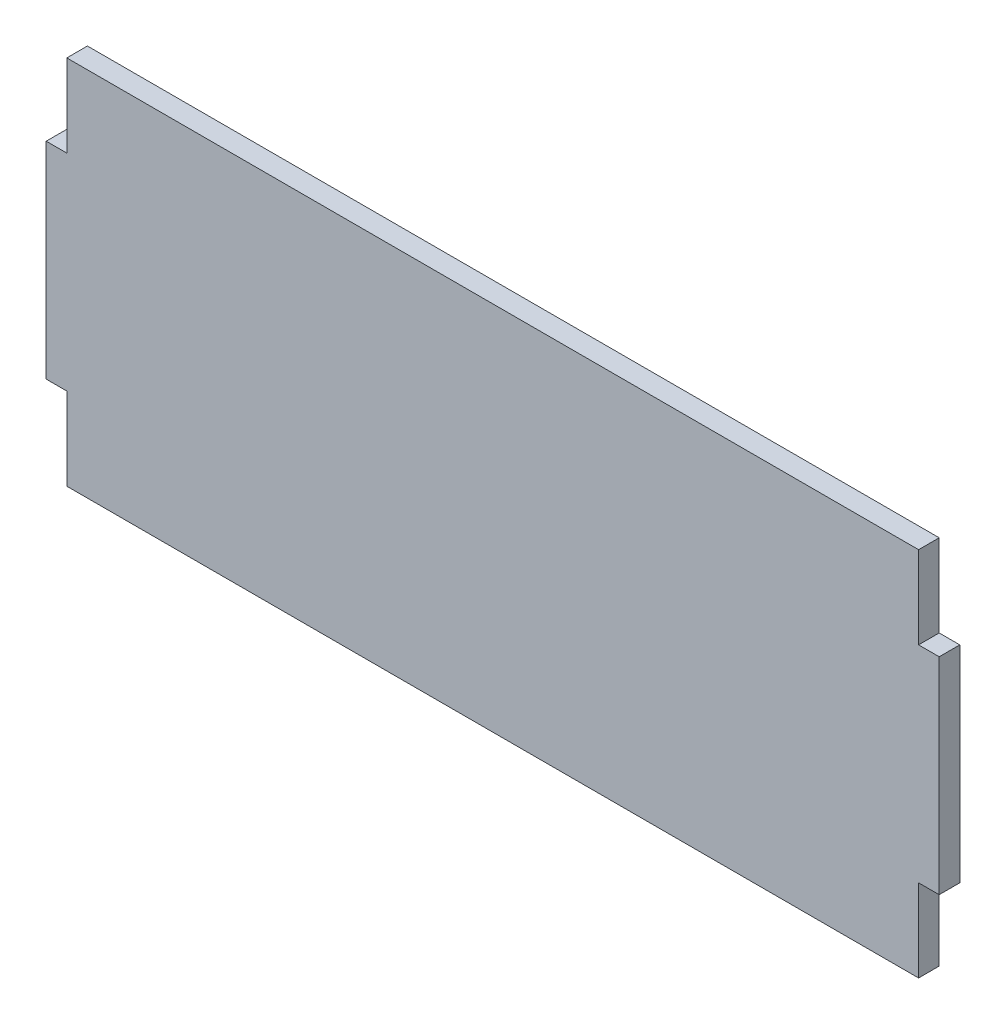
ISO-10303-21;
HEADER;
FILE_DESCRIPTION(('STEP AP214'),'2;1');
FILE_NAME('part.step','',(''),(''),'','','');
FILE_SCHEMA(('AUTOMOTIVE_DESIGN { 1 0 10303 214 1 1 1 1 }'));
ENDSEC;
DATA;
#1=APPLICATION_CONTEXT('core data for automotive mechanical design processes');
#2=APPLICATION_PROTOCOL_DEFINITION('international standard','automotive_design',2000,#1);
#3=PRODUCT_CONTEXT('',#1,'mechanical');
#4=PRODUCT('Part','Part','',(#3));
#5=PRODUCT_RELATED_PRODUCT_CATEGORY('part','',(#4));
#6=PRODUCT_DEFINITION_FORMATION('','',#4);
#7=PRODUCT_DEFINITION_CONTEXT('part definition',#1,'design');
#8=PRODUCT_DEFINITION('design','',#6,#7);
#9=PRODUCT_DEFINITION_SHAPE('','',#8);
#10=(LENGTH_UNIT() NAMED_UNIT(*) SI_UNIT(.MILLI.,.METRE.));
#11=(NAMED_UNIT(*) PLANE_ANGLE_UNIT() SI_UNIT($,.RADIAN.));
#12=(NAMED_UNIT(*) SI_UNIT($,.STERADIAN.) SOLID_ANGLE_UNIT());
#13=UNCERTAINTY_MEASURE_WITH_UNIT(LENGTH_MEASURE(1.E-05),#10,'distance_accuracy_value','');
#14=(GEOMETRIC_REPRESENTATION_CONTEXT(3) GLOBAL_UNCERTAINTY_ASSIGNED_CONTEXT((#13)) GLOBAL_UNIT_ASSIGNED_CONTEXT((#10,
#11,#12)) REPRESENTATION_CONTEXT('',''));
#15=CARTESIAN_POINT('',(0.,0.,0.));
#16=DIRECTION('',(0.,0.,1.));
#17=DIRECTION('',(1.,0.,0.));
#18=AXIS2_PLACEMENT_3D('',#15,#16,#17);
#19=CARTESIAN_POINT('',(124.,0.,3.));
#20=DIRECTION('',(0.,1.,0.));
#21=DIRECTION('',(0.,0.,1.));
#22=AXIS2_PLACEMENT_3D('',#19,#20,#21);
#23=PLANE('',#22);
#24=DIRECTION('',(1.,0.,0.));
#25=VECTOR('',#24,1.);
#26=CARTESIAN_POINT('',(124.,0.,0.));
#27=LINE('',#26,#25);
#28=CARTESIAN_POINT('',(0.,0.,0.));
#29=VERTEX_POINT('',#28);
#30=CARTESIAN_POINT('',(124.,0.,0.));
#31=VERTEX_POINT('',#30);
#32=EDGE_CURVE('E153',#29,#31,#27,.T.);
#33=ORIENTED_EDGE('',*,*,#32,.T.);
#34=DIRECTION('',(0.,0.,-1.));
#35=VECTOR('',#34,1.);
#36=CARTESIAN_POINT('',(124.,0.,3.));
#37=LINE('',#36,#35);
#38=CARTESIAN_POINT('',(124.,0.,3.));
#39=VERTEX_POINT('',#38);
#40=EDGE_CURVE('E11',#39,#31,#37,.T.);
#41=ORIENTED_EDGE('',*,*,#40,.F.);
#42=DIRECTION('',(1.,0.,0.));
#43=VECTOR('',#42,1.);
#44=CARTESIAN_POINT('',(124.,0.,3.));
#45=LINE('',#44,#43);
#46=CARTESIAN_POINT('',(0.,0.,3.));
#47=VERTEX_POINT('',#46);
#48=EDGE_CURVE('E175',#47,#39,#45,.T.);
#49=ORIENTED_EDGE('',*,*,#48,.F.);
#50=DIRECTION('',(0.,0.,-1.));
#51=VECTOR('',#50,1.);
#52=CARTESIAN_POINT('',(0.,0.,3.));
#53=LINE('',#52,#51);
#54=EDGE_CURVE('E149',#47,#29,#53,.T.);
#55=ORIENTED_EDGE('',*,*,#54,.T.);
#56=EDGE_LOOP('',(#33,#41,#49,#55));
#57=FACE_BOUND('',#56,.T.);
#58=ADVANCED_FACE('F33',(#57),#23,.F.);
#59=CARTESIAN_POINT('',(124.,12.,3.));
#60=DIRECTION('',(-1.,0.,0.));
#61=DIRECTION('',(0.,0.,1.));
#62=AXIS2_PLACEMENT_3D('',#59,#60,#61);
#63=PLANE('',#62);
#64=DIRECTION('',(0.,1.,0.));
#65=VECTOR('',#64,1.);
#66=CARTESIAN_POINT('',(124.,12.,0.));
#67=LINE('',#66,#65);
#68=CARTESIAN_POINT('',(124.,12.,0.));
#69=VERTEX_POINT('',#68);
#70=EDGE_CURVE('E156',#31,#69,#67,.T.);
#71=ORIENTED_EDGE('',*,*,#70,.T.);
#72=DIRECTION('',(0.,0.,-1.));
#73=VECTOR('',#72,1.);
#74=CARTESIAN_POINT('',(124.,12.,3.));
#75=LINE('',#74,#73);
#76=CARTESIAN_POINT('',(124.,12.,3.));
#77=VERTEX_POINT('',#76);
#78=EDGE_CURVE('E41',#77,#69,#75,.T.);
#79=ORIENTED_EDGE('',*,*,#78,.F.);
#80=DIRECTION('',(0.,1.,0.));
#81=VECTOR('',#80,1.);
#82=CARTESIAN_POINT('',(124.,12.,3.));
#83=LINE('',#82,#81);
#84=EDGE_CURVE('E104',#39,#77,#83,.T.);
#85=ORIENTED_EDGE('',*,*,#84,.F.);
#86=ORIENTED_EDGE('',*,*,#40,.T.);
#87=EDGE_LOOP('',(#71,#79,#85,#86));
#88=FACE_BOUND('',#87,.T.);
#89=ADVANCED_FACE('F253',(#88),#63,.F.);
#90=CARTESIAN_POINT('',(127.,12.,3.));
#91=DIRECTION('',(0.,1.,0.));
#92=DIRECTION('',(-1.,0.,0.));
#93=AXIS2_PLACEMENT_3D('',#90,#91,#92);
#94=PLANE('',#93);
#95=DIRECTION('',(1.,0.,0.));
#96=VECTOR('',#95,1.);
#97=CARTESIAN_POINT('',(127.,12.,0.));
#98=LINE('',#97,#96);
#99=CARTESIAN_POINT('',(127.,12.,0.));
#100=VERTEX_POINT('',#99);
#101=EDGE_CURVE('E158',#69,#100,#98,.T.);
#102=ORIENTED_EDGE('',*,*,#101,.T.);
#103=DIRECTION('',(0.,0.,-1.));
#104=VECTOR('',#103,1.);
#105=CARTESIAN_POINT('',(127.,12.,3.));
#106=LINE('',#105,#104);
#107=CARTESIAN_POINT('',(127.,12.,3.));
#108=VERTEX_POINT('',#107);
#109=EDGE_CURVE('E194',#108,#100,#106,.T.);
#110=ORIENTED_EDGE('',*,*,#109,.F.);
#111=DIRECTION('',(1.,0.,0.));
#112=VECTOR('',#111,1.);
#113=CARTESIAN_POINT('',(127.,12.,3.));
#114=LINE('',#113,#112);
#115=EDGE_CURVE('E202',#77,#108,#114,.T.);
#116=ORIENTED_EDGE('',*,*,#115,.F.);
#117=ORIENTED_EDGE('',*,*,#78,.T.);
#118=EDGE_LOOP('',(#102,#110,#116,#117));
#119=FACE_BOUND('',#118,.T.);
#120=ADVANCED_FACE('F200',(#119),#94,.F.);
#121=CARTESIAN_POINT('',(127.,42.,3.));
#122=DIRECTION('',(-1.,0.,0.));
#123=DIRECTION('',(0.,0.,1.));
#124=AXIS2_PLACEMENT_3D('',#121,#122,#123);
#125=PLANE('',#124);
#126=DIRECTION('',(0.,1.,0.));
#127=VECTOR('',#126,1.);
#128=CARTESIAN_POINT('',(127.,42.,0.));
#129=LINE('',#128,#127);
#130=CARTESIAN_POINT('',(127.,42.,0.));
#131=VERTEX_POINT('',#130);
#132=EDGE_CURVE('E160',#100,#131,#129,.T.);
#133=ORIENTED_EDGE('',*,*,#132,.T.);
#134=DIRECTION('',(0.,0.,-1.));
#135=VECTOR('',#134,1.);
#136=CARTESIAN_POINT('',(127.,42.,3.));
#137=LINE('',#136,#135);
#138=CARTESIAN_POINT('',(127.,42.,3.));
#139=VERTEX_POINT('',#138);
#140=EDGE_CURVE('E191',#139,#131,#137,.T.);
#141=ORIENTED_EDGE('',*,*,#140,.F.);
#142=DIRECTION('',(0.,1.,0.));
#143=VECTOR('',#142,1.);
#144=CARTESIAN_POINT('',(127.,42.,3.));
#145=LINE('',#144,#143);
#146=EDGE_CURVE('E220',#108,#139,#145,.T.);
#147=ORIENTED_EDGE('',*,*,#146,.F.);
#148=ORIENTED_EDGE('',*,*,#109,.T.);
#149=EDGE_LOOP('',(#133,#141,#147,#148));
#150=FACE_BOUND('',#149,.T.);
#151=ADVANCED_FACE('F211',(#150),#125,.F.);
#152=CARTESIAN_POINT('',(124.,42.,3.));
#153=DIRECTION('',(0.,-1.,0.));
#154=DIRECTION('',(0.,0.,-1.));
#155=AXIS2_PLACEMENT_3D('',#152,#153,#154);
#156=PLANE('',#155);
#157=DIRECTION('',(-1.,0.,0.));
#158=VECTOR('',#157,1.);
#159=CARTESIAN_POINT('',(124.,42.,0.));
#160=LINE('',#159,#158);
#161=CARTESIAN_POINT('',(124.,42.,0.));
#162=VERTEX_POINT('',#161);
#163=EDGE_CURVE('E162',#131,#162,#160,.T.);
#164=ORIENTED_EDGE('',*,*,#163,.T.);
#165=DIRECTION('',(0.,0.,-1.));
#166=VECTOR('',#165,1.);
#167=CARTESIAN_POINT('',(124.,42.,3.));
#168=LINE('',#167,#166);
#169=CARTESIAN_POINT('',(124.,42.,3.));
#170=VERTEX_POINT('',#169);
#171=EDGE_CURVE('E188',#170,#162,#168,.T.);
#172=ORIENTED_EDGE('',*,*,#171,.F.);
#173=DIRECTION('',(-1.,0.,0.));
#174=VECTOR('',#173,1.);
#175=CARTESIAN_POINT('',(124.,42.,3.));
#176=LINE('',#175,#174);
#177=EDGE_CURVE('E217',#139,#170,#176,.T.);
#178=ORIENTED_EDGE('',*,*,#177,.F.);
#179=ORIENTED_EDGE('',*,*,#140,.T.);
#180=EDGE_LOOP('',(#164,#172,#178,#179));
#181=FACE_BOUND('',#180,.T.);
#182=ADVANCED_FACE('F215',(#181),#156,.F.);
#183=CARTESIAN_POINT('',(124.,54.,3.));
#184=DIRECTION('',(-1.,0.,0.));
#185=DIRECTION('',(0.,0.,1.));
#186=AXIS2_PLACEMENT_3D('',#183,#184,#185);
#187=PLANE('',#186);
#188=DIRECTION('',(0.,1.,0.));
#189=VECTOR('',#188,1.);
#190=CARTESIAN_POINT('',(124.,54.,0.));
#191=LINE('',#190,#189);
#192=CARTESIAN_POINT('',(124.,54.,0.));
#193=VERTEX_POINT('',#192);
#194=EDGE_CURVE('E164',#162,#193,#191,.T.);
#195=ORIENTED_EDGE('',*,*,#194,.T.);
#196=DIRECTION('',(0.,0.,-1.));
#197=VECTOR('',#196,1.);
#198=CARTESIAN_POINT('',(124.,54.,3.));
#199=LINE('',#198,#197);
#200=CARTESIAN_POINT('',(124.,54.,3.));
#201=VERTEX_POINT('',#200);
#202=EDGE_CURVE('E185',#201,#193,#199,.T.);
#203=ORIENTED_EDGE('',*,*,#202,.F.);
#204=DIRECTION('',(0.,1.,0.));
#205=VECTOR('',#204,1.);
#206=CARTESIAN_POINT('',(124.,54.,3.));
#207=LINE('',#206,#205);
#208=EDGE_CURVE('E219',#170,#201,#207,.T.);
#209=ORIENTED_EDGE('',*,*,#208,.F.);
#210=ORIENTED_EDGE('',*,*,#171,.T.);
#211=EDGE_LOOP('',(#195,#203,#209,#210));
#212=FACE_BOUND('',#211,.T.);
#213=ADVANCED_FACE('F266',(#212),#187,.F.);
#214=CARTESIAN_POINT('',(0.,54.,3.));
#215=DIRECTION('',(0.,-1.,0.));
#216=DIRECTION('',(0.,0.,-1.));
#217=AXIS2_PLACEMENT_3D('',#214,#215,#216);
#218=PLANE('',#217);
#219=DIRECTION('',(-1.,0.,0.));
#220=VECTOR('',#219,1.);
#221=CARTESIAN_POINT('',(0.,54.,0.));
#222=LINE('',#221,#220);
#223=CARTESIAN_POINT('',(0.,54.,0.));
#224=VERTEX_POINT('',#223);
#225=EDGE_CURVE('E166',#193,#224,#222,.T.);
#226=ORIENTED_EDGE('',*,*,#225,.T.);
#227=DIRECTION('',(0.,0.,-1.));
#228=VECTOR('',#227,1.);
#229=CARTESIAN_POINT('',(0.,54.,3.));
#230=LINE('',#229,#228);
#231=CARTESIAN_POINT('',(0.,54.,3.));
#232=VERTEX_POINT('',#231);
#233=EDGE_CURVE('E182',#232,#224,#230,.T.);
#234=ORIENTED_EDGE('',*,*,#233,.F.);
#235=DIRECTION('',(-1.,0.,0.));
#236=VECTOR('',#235,1.);
#237=CARTESIAN_POINT('',(0.,54.,3.));
#238=LINE('',#237,#236);
#239=EDGE_CURVE('E222',#201,#232,#238,.T.);
#240=ORIENTED_EDGE('',*,*,#239,.F.);
#241=ORIENTED_EDGE('',*,*,#202,.T.);
#242=EDGE_LOOP('',(#226,#234,#240,#241));
#243=FACE_BOUND('',#242,.T.);
#244=ADVANCED_FACE('F269',(#243),#218,.F.);
#245=CARTESIAN_POINT('',(0.,42.,3.));
#246=DIRECTION('',(1.,0.,0.));
#247=DIRECTION('',(0.,1.,0.));
#248=AXIS2_PLACEMENT_3D('',#245,#246,#247);
#249=PLANE('',#248);
#250=DIRECTION('',(0.,-1.,0.));
#251=VECTOR('',#250,1.);
#252=CARTESIAN_POINT('',(0.,42.,0.));
#253=LINE('',#252,#251);
#254=CARTESIAN_POINT('',(0.,42.,0.));
#255=VERTEX_POINT('',#254);
#256=EDGE_CURVE('E168',#224,#255,#253,.T.);
#257=ORIENTED_EDGE('',*,*,#256,.T.);
#258=DIRECTION('',(0.,0.,-1.));
#259=VECTOR('',#258,1.);
#260=CARTESIAN_POINT('',(0.,42.,3.));
#261=LINE('',#260,#259);
#262=CARTESIAN_POINT('',(0.,42.,3.));
#263=VERTEX_POINT('',#262);
#264=EDGE_CURVE('E179',#263,#255,#261,.T.);
#265=ORIENTED_EDGE('',*,*,#264,.F.);
#266=DIRECTION('',(0.,-1.,0.));
#267=VECTOR('',#266,1.);
#268=CARTESIAN_POINT('',(0.,42.,3.));
#269=LINE('',#268,#267);
#270=EDGE_CURVE('E228',#232,#263,#269,.T.);
#271=ORIENTED_EDGE('',*,*,#270,.F.);
#272=ORIENTED_EDGE('',*,*,#233,.T.);
#273=EDGE_LOOP('',(#257,#265,#271,#272));
#274=FACE_BOUND('',#273,.T.);
#275=ADVANCED_FACE('F234',(#274),#249,.F.);
#276=CARTESIAN_POINT('',(-3.,42.,3.));
#277=DIRECTION('',(0.,-1.,0.));
#278=DIRECTION('',(0.,0.,-1.));
#279=AXIS2_PLACEMENT_3D('',#276,#277,#278);
#280=PLANE('',#279);
#281=DIRECTION('',(-1.,0.,0.));
#282=VECTOR('',#281,1.);
#283=CARTESIAN_POINT('',(-3.,42.,0.));
#284=LINE('',#283,#282);
#285=CARTESIAN_POINT('',(-3.,42.,0.));
#286=VERTEX_POINT('',#285);
#287=EDGE_CURVE('E170',#255,#286,#284,.T.);
#288=ORIENTED_EDGE('',*,*,#287,.T.);
#289=DIRECTION('',(0.,0.,-1.));
#290=VECTOR('',#289,1.);
#291=CARTESIAN_POINT('',(-3.,42.,3.));
#292=LINE('',#291,#290);
#293=CARTESIAN_POINT('',(-3.,42.,3.));
#294=VERTEX_POINT('',#293);
#295=EDGE_CURVE('E144',#294,#286,#292,.T.);
#296=ORIENTED_EDGE('',*,*,#295,.F.);
#297=DIRECTION('',(-1.,0.,0.));
#298=VECTOR('',#297,1.);
#299=CARTESIAN_POINT('',(-3.,42.,3.));
#300=LINE('',#299,#298);
#301=EDGE_CURVE('E135',#263,#294,#300,.T.);
#302=ORIENTED_EDGE('',*,*,#301,.F.);
#303=ORIENTED_EDGE('',*,*,#264,.T.);
#304=EDGE_LOOP('',(#288,#296,#302,#303));
#305=FACE_BOUND('',#304,.T.);
#306=ADVANCED_FACE('F238',(#305),#280,.F.);
#307=CARTESIAN_POINT('',(-3.,12.,3.));
#308=DIRECTION('',(1.,0.,0.));
#309=DIRECTION('',(0.,0.,-1.));
#310=AXIS2_PLACEMENT_3D('',#307,#308,#309);
#311=PLANE('',#310);
#312=DIRECTION('',(0.,-1.,0.));
#313=VECTOR('',#312,1.);
#314=CARTESIAN_POINT('',(-3.,12.,0.));
#315=LINE('',#314,#313);
#316=CARTESIAN_POINT('',(-3.,12.,0.));
#317=VERTEX_POINT('',#316);
#318=EDGE_CURVE('E143',#286,#317,#315,.T.);
#319=ORIENTED_EDGE('',*,*,#318,.T.);
#320=DIRECTION('',(0.,0.,-1.));
#321=VECTOR('',#320,1.);
#322=CARTESIAN_POINT('',(-3.,12.,3.));
#323=LINE('',#322,#321);
#324=CARTESIAN_POINT('',(-3.,12.,3.));
#325=VERTEX_POINT('',#324);
#326=EDGE_CURVE('E140',#325,#317,#323,.T.);
#327=ORIENTED_EDGE('',*,*,#326,.F.);
#328=DIRECTION('',(0.,-1.,0.));
#329=VECTOR('',#328,1.);
#330=CARTESIAN_POINT('',(-3.,12.,3.));
#331=LINE('',#330,#329);
#332=EDGE_CURVE('E129',#294,#325,#331,.T.);
#333=ORIENTED_EDGE('',*,*,#332,.F.);
#334=ORIENTED_EDGE('',*,*,#295,.T.);
#335=EDGE_LOOP('',(#319,#327,#333,#334));
#336=FACE_BOUND('',#335,.T.);
#337=ADVANCED_FACE('F141',(#336),#311,.F.);
#338=CARTESIAN_POINT('',(0.,12.,3.));
#339=DIRECTION('',(0.,1.,0.));
#340=DIRECTION('',(-1.,0.,0.));
#341=AXIS2_PLACEMENT_3D('',#338,#339,#340);
#342=PLANE('',#341);
#343=DIRECTION('',(1.,0.,0.));
#344=VECTOR('',#343,1.);
#345=CARTESIAN_POINT('',(0.,12.,0.));
#346=LINE('',#345,#344);
#347=CARTESIAN_POINT('',(0.,12.,0.));
#348=VERTEX_POINT('',#347);
#349=EDGE_CURVE('E90',#317,#348,#346,.T.);
#350=ORIENTED_EDGE('',*,*,#349,.T.);
#351=DIRECTION('',(0.,0.,-1.));
#352=VECTOR('',#351,1.);
#353=CARTESIAN_POINT('',(0.,12.,3.));
#354=LINE('',#353,#352);
#355=CARTESIAN_POINT('',(0.,12.,3.));
#356=VERTEX_POINT('',#355);
#357=EDGE_CURVE('E145',#356,#348,#354,.T.);
#358=ORIENTED_EDGE('',*,*,#357,.F.);
#359=DIRECTION('',(1.,0.,0.));
#360=VECTOR('',#359,1.);
#361=CARTESIAN_POINT('',(0.,12.,3.));
#362=LINE('',#361,#360);
#363=EDGE_CURVE('E133',#325,#356,#362,.T.);
#364=ORIENTED_EDGE('',*,*,#363,.F.);
#365=ORIENTED_EDGE('',*,*,#326,.T.);
#366=EDGE_LOOP('',(#350,#358,#364,#365));
#367=FACE_BOUND('',#366,.T.);
#368=ADVANCED_FACE('F147',(#367),#342,.F.);
#369=CARTESIAN_POINT('',(0.,0.,3.));
#370=DIRECTION('',(1.,0.,0.));
#371=DIRECTION('',(0.,0.,-1.));
#372=AXIS2_PLACEMENT_3D('',#369,#370,#371);
#373=PLANE('',#372);
#374=DIRECTION('',(0.,-1.,0.));
#375=VECTOR('',#374,1.);
#376=CARTESIAN_POINT('',(0.,0.,0.));
#377=LINE('',#376,#375);
#378=EDGE_CURVE('E96',#348,#29,#377,.T.);
#379=ORIENTED_EDGE('',*,*,#378,.T.);
#380=ORIENTED_EDGE('',*,*,#54,.F.);
#381=DIRECTION('',(0.,-1.,0.));
#382=VECTOR('',#381,1.);
#383=CARTESIAN_POINT('',(0.,0.,3.));
#384=LINE('',#383,#382);
#385=EDGE_CURVE('E49',#356,#47,#384,.T.);
#386=ORIENTED_EDGE('',*,*,#385,.F.);
#387=ORIENTED_EDGE('',*,*,#357,.T.);
#388=EDGE_LOOP('',(#379,#380,#386,#387));
#389=FACE_BOUND('',#388,.T.);
#390=ADVANCED_FACE('F242',(#389),#373,.F.);
#391=CARTESIAN_POINT('',(0.,0.,3.));
#392=DIRECTION('',(0.,0.,-1.));
#393=DIRECTION('',(-1.,0.,0.));
#394=AXIS2_PLACEMENT_3D('',#391,#392,#393);
#395=PLANE('',#394);
#396=ORIENTED_EDGE('',*,*,#48,.T.);
#397=ORIENTED_EDGE('',*,*,#84,.T.);
#398=ORIENTED_EDGE('',*,*,#115,.T.);
#399=ORIENTED_EDGE('',*,*,#146,.T.);
#400=ORIENTED_EDGE('',*,*,#177,.T.);
#401=ORIENTED_EDGE('',*,*,#208,.T.);
#402=ORIENTED_EDGE('',*,*,#239,.T.);
#403=ORIENTED_EDGE('',*,*,#270,.T.);
#404=ORIENTED_EDGE('',*,*,#301,.T.);
#405=ORIENTED_EDGE('',*,*,#332,.T.);
#406=ORIENTED_EDGE('',*,*,#363,.T.);
#407=ORIENTED_EDGE('',*,*,#385,.T.);
#408=EDGE_LOOP('',(#396,#397,#398,#399,#400,#401,#402,#403,#404,#405,#406,#407));
#409=FACE_BOUND('',#408,.T.);
#410=ADVANCED_FACE('F131',(#409),#395,.F.);
#411=CARTESIAN_POINT('',(0.,0.,0.));
#412=DIRECTION('',(0.,0.,-1.));
#413=DIRECTION('',(-1.,0.,0.));
#414=AXIS2_PLACEMENT_3D('',#411,#412,#413);
#415=PLANE('',#414);
#416=ORIENTED_EDGE('',*,*,#32,.F.);
#417=ORIENTED_EDGE('',*,*,#378,.F.);
#418=ORIENTED_EDGE('',*,*,#349,.F.);
#419=ORIENTED_EDGE('',*,*,#318,.F.);
#420=ORIENTED_EDGE('',*,*,#287,.F.);
#421=ORIENTED_EDGE('',*,*,#256,.F.);
#422=ORIENTED_EDGE('',*,*,#225,.F.);
#423=ORIENTED_EDGE('',*,*,#194,.F.);
#424=ORIENTED_EDGE('',*,*,#163,.F.);
#425=ORIENTED_EDGE('',*,*,#132,.F.);
#426=ORIENTED_EDGE('',*,*,#101,.F.);
#427=ORIENTED_EDGE('',*,*,#70,.F.);
#428=EDGE_LOOP('',(#416,#417,#418,#419,#420,#421,#422,#423,#424,#425,#426,#427));
#429=FACE_BOUND('',#428,.T.);
#430=ADVANCED_FACE('F206',(#429),#415,.T.);
#431=CLOSED_SHELL('',(#58,#89,#120,#151,#182,#213,#244,#275,#306,#337,#368,#390,#410,#430));
#432=MANIFOLD_SOLID_BREP('B2',#431);
#433=ADVANCED_BREP_SHAPE_REPRESENTATION('',(#18,#432),#14);
#434=SHAPE_DEFINITION_REPRESENTATION(#9,#433);
ENDSEC;
END-ISO-10303-21;
